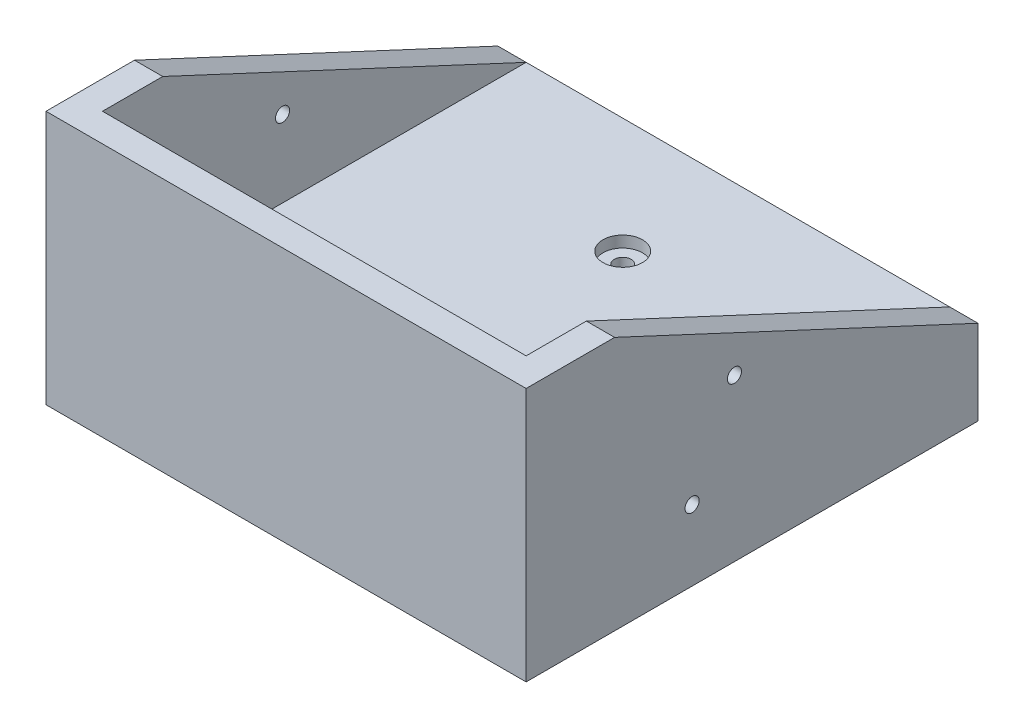
ISO-10303-21;
HEADER;
FILE_DESCRIPTION(('STEP AP214'),'2;1');
FILE_NAME('part.step','',(''),(''),'','','');
FILE_SCHEMA(('AUTOMOTIVE_DESIGN { 1 0 10303 214 1 1 1 1 }'));
ENDSEC;
DATA;
#1=APPLICATION_CONTEXT('core data for automotive mechanical design processes');
#2=APPLICATION_PROTOCOL_DEFINITION('international standard','automotive_design',2000,#1);
#3=PRODUCT_CONTEXT('',#1,'mechanical');
#4=PRODUCT('Part','Part','',(#3));
#5=PRODUCT_RELATED_PRODUCT_CATEGORY('part','',(#4));
#6=PRODUCT_DEFINITION_FORMATION('','',#4);
#7=PRODUCT_DEFINITION_CONTEXT('part definition',#1,'design');
#8=PRODUCT_DEFINITION('design','',#6,#7);
#9=PRODUCT_DEFINITION_SHAPE('','',#8);
#10=(LENGTH_UNIT() NAMED_UNIT(*) SI_UNIT(.MILLI.,.METRE.));
#11=(NAMED_UNIT(*) PLANE_ANGLE_UNIT() SI_UNIT($,.RADIAN.));
#12=(NAMED_UNIT(*) SI_UNIT($,.STERADIAN.) SOLID_ANGLE_UNIT());
#13=UNCERTAINTY_MEASURE_WITH_UNIT(LENGTH_MEASURE(1.E-05),#10,'distance_accuracy_value','');
#14=(GEOMETRIC_REPRESENTATION_CONTEXT(3) GLOBAL_UNCERTAINTY_ASSIGNED_CONTEXT((#13)) GLOBAL_UNIT_ASSIGNED_CONTEXT((#10,
#11,#12)) REPRESENTATION_CONTEXT('',''));
#15=CARTESIAN_POINT('',(0.,0.,0.));
#16=DIRECTION('',(0.,0.,1.));
#17=DIRECTION('',(1.,0.,0.));
#18=AXIS2_PLACEMENT_3D('',#15,#16,#17);
#19=CARTESIAN_POINT('',(0.,0.,0.));
#20=DIRECTION('',(0.,-1.,0.));
#21=DIRECTION('',(0.,0.,-1.));
#22=AXIS2_PLACEMENT_3D('',#19,#20,#21);
#23=PLANE('',#22);
#24=CARTESIAN_POINT('',(0.,0.,-19.6));
#25=DIRECTION('',(0.,-1.,0.));
#26=DIRECTION('',(0.,0.,1.));
#27=AXIS2_PLACEMENT_3D('',#24,#25,#26);
#28=CIRCLE('',#27,1.5);
#29=CARTESIAN_POINT('',(0.,0.,-18.1));
#30=VERTEX_POINT('',#29);
#31=EDGE_CURVE('E308',#30,#30,#28,.T.);
#32=ORIENTED_EDGE('',*,*,#31,.F.);
#33=EDGE_LOOP('',(#32));
#34=FACE_BOUND('',#33,.T.);
#35=CARTESIAN_POINT('',(0.,0.,19.6));
#36=DIRECTION('',(0.,-1.,0.));
#37=DIRECTION('',(0.,0.,-1.));
#38=AXIS2_PLACEMENT_3D('',#35,#36,#37);
#39=CIRCLE('',#38,1.5);
#40=CARTESIAN_POINT('',(0.,0.,18.1));
#41=VERTEX_POINT('',#40);
#42=EDGE_CURVE('E309',#41,#41,#39,.T.);
#43=ORIENTED_EDGE('',*,*,#42,.F.);
#44=EDGE_LOOP('',(#43));
#45=FACE_BOUND('',#44,.T.);
#46=DIRECTION('',(1.,0.,0.));
#47=VECTOR('',#46,1.);
#48=CARTESIAN_POINT('',(-29.5,0.,-24.));
#49=LINE('',#48,#47);
#50=CARTESIAN_POINT('',(-29.5,0.,-24.));
#51=VERTEX_POINT('',#50);
#52=CARTESIAN_POINT('',(29.5,0.,-24.));
#53=VERTEX_POINT('',#52);
#54=EDGE_CURVE('E162',#51,#53,#49,.T.);
#55=ORIENTED_EDGE('',*,*,#54,.T.);
#56=DIRECTION('',(0.,0.,1.));
#57=VECTOR('',#56,1.);
#58=CARTESIAN_POINT('',(29.5,0.,-24.));
#59=LINE('',#58,#57);
#60=CARTESIAN_POINT('',(29.5,0.,-17.0000000000001));
#61=VERTEX_POINT('',#60);
#62=EDGE_CURVE('E190',#53,#61,#59,.T.);
#63=ORIENTED_EDGE('',*,*,#62,.T.);
#64=DIRECTION('',(1.,0.,0.));
#65=VECTOR('',#64,1.);
#66=CARTESIAN_POINT('',(29.5,0.,-17.0000000000001));
#67=LINE('',#66,#65);
#68=CARTESIAN_POINT('',(32.,0.,-17.));
#69=VERTEX_POINT('',#68);
#70=EDGE_CURVE('E168',#61,#69,#67,.T.);
#71=ORIENTED_EDGE('',*,*,#70,.T.);
#72=DIRECTION('',(0.,0.,1.));
#73=VECTOR('',#72,1.);
#74=CARTESIAN_POINT('',(32.,0.,-17.));
#75=LINE('',#74,#73);
#76=CARTESIAN_POINT('',(32.,0.,-5.));
#77=VERTEX_POINT('',#76);
#78=EDGE_CURVE('E193',#69,#77,#75,.T.);
#79=ORIENTED_EDGE('',*,*,#78,.T.);
#80=DIRECTION('',(-1.,0.,0.));
#81=VECTOR('',#80,1.);
#82=CARTESIAN_POINT('',(29.5,0.,-4.99999999999993));
#83=LINE('',#82,#81);
#84=CARTESIAN_POINT('',(29.5,0.,-4.99999999999993));
#85=VERTEX_POINT('',#84);
#86=EDGE_CURVE('E196',#77,#85,#83,.T.);
#87=ORIENTED_EDGE('',*,*,#86,.T.);
#88=DIRECTION('',(0.,0.,1.));
#89=VECTOR('',#88,1.);
#90=CARTESIAN_POINT('',(29.5,0.,-4.99999999999993));
#91=LINE('',#90,#89);
#92=CARTESIAN_POINT('',(29.5,0.,24.));
#93=VERTEX_POINT('',#92);
#94=EDGE_CURVE('E199',#85,#93,#91,.T.);
#95=ORIENTED_EDGE('',*,*,#94,.T.);
#96=DIRECTION('',(-1.,0.,0.));
#97=VECTOR('',#96,1.);
#98=CARTESIAN_POINT('',(29.5,0.,24.));
#99=LINE('',#98,#97);
#100=CARTESIAN_POINT('',(-29.5,0.,24.));
#101=VERTEX_POINT('',#100);
#102=EDGE_CURVE('E202',#93,#101,#99,.T.);
#103=ORIENTED_EDGE('',*,*,#102,.T.);
#104=DIRECTION('',(0.,0.,-1.));
#105=VECTOR('',#104,1.);
#106=CARTESIAN_POINT('',(-29.5,0.,24.));
#107=LINE('',#106,#105);
#108=EDGE_CURVE('E205',#101,#51,#107,.T.);
#109=ORIENTED_EDGE('',*,*,#108,.T.);
#110=EDGE_LOOP('',(#55,#63,#71,#79,#87,#95,#103,#109));
#111=FACE_BOUND('',#110,.T.);
#112=ADVANCED_FACE('F33',(#34,#45,#111),#23,.T.);
#113=CARTESIAN_POINT('',(0.,5.,-19.6));
#114=DIRECTION('',(0.,-1.,0.));
#115=DIRECTION('',(0.,0.,-1.));
#116=AXIS2_PLACEMENT_3D('',#113,#114,#115);
#117=CYLINDRICAL_SURFACE('',#116,1.5);
#118=ORIENTED_EDGE('',*,*,#31,.T.);
#119=EDGE_LOOP('',(#118));
#120=FACE_BOUND('',#119,.T.);
#121=CARTESIAN_POINT('',(0.,3.,-19.6));
#122=DIRECTION('',(0.,1.,0.));
#123=DIRECTION('',(0.,0.,1.));
#124=AXIS2_PLACEMENT_3D('',#121,#122,#123);
#125=CIRCLE('',#124,1.5);
#126=CARTESIAN_POINT('',(0.,3.,-18.1));
#127=VERTEX_POINT('',#126);
#128=EDGE_CURVE('E298',#127,#127,#125,.F.);
#129=ORIENTED_EDGE('',*,*,#128,.F.);
#130=EDGE_LOOP('',(#129));
#131=FACE_BOUND('',#130,.T.);
#132=ADVANCED_FACE('F331',(#120,#131),#117,.F.);
#133=CARTESIAN_POINT('',(0.,5.,19.6));
#134=DIRECTION('',(0.,-1.,0.));
#135=DIRECTION('',(0.,0.,-1.));
#136=AXIS2_PLACEMENT_3D('',#133,#134,#135);
#137=CYLINDRICAL_SURFACE('',#136,1.5);
#138=ORIENTED_EDGE('',*,*,#42,.T.);
#139=EDGE_LOOP('',(#138));
#140=FACE_BOUND('',#139,.T.);
#141=CARTESIAN_POINT('',(0.,3.,19.6));
#142=DIRECTION('',(0.,1.,0.));
#143=DIRECTION('',(0.,0.,1.));
#144=AXIS2_PLACEMENT_3D('',#141,#142,#143);
#145=CIRCLE('',#144,1.5);
#146=CARTESIAN_POINT('',(0.,3.,21.1));
#147=VERTEX_POINT('',#146);
#148=EDGE_CURVE('E268',#147,#147,#145,.F.);
#149=ORIENTED_EDGE('',*,*,#148,.F.);
#150=EDGE_LOOP('',(#149));
#151=FACE_BOUND('',#150,.T.);
#152=ADVANCED_FACE('F333',(#140,#151),#137,.F.);
#153=CARTESIAN_POINT('',(0.,5.,0.));
#154=DIRECTION('',(0.,-1.,0.));
#155=DIRECTION('',(0.,0.,-1.));
#156=AXIS2_PLACEMENT_3D('',#153,#154,#155);
#157=PLANE('',#156);
#158=CARTESIAN_POINT('',(0.,5.,19.6));
#159=DIRECTION('',(0.,1.,0.));
#160=DIRECTION('',(0.,0.,1.));
#161=AXIS2_PLACEMENT_3D('',#158,#159,#160);
#162=CIRCLE('',#161,3.5);
#163=CARTESIAN_POINT('',(0.,5.,23.1));
#164=VERTEX_POINT('',#163);
#165=EDGE_CURVE('E269',#164,#164,#162,.T.);
#166=ORIENTED_EDGE('',*,*,#165,.F.);
#167=EDGE_LOOP('',(#166));
#168=FACE_BOUND('',#167,.T.);
#169=CARTESIAN_POINT('',(0.,5.,-19.6));
#170=DIRECTION('',(0.,1.,0.));
#171=DIRECTION('',(0.,0.,1.));
#172=AXIS2_PLACEMENT_3D('',#169,#170,#171);
#173=CIRCLE('',#172,3.5);
#174=CARTESIAN_POINT('',(0.,5.,-16.1));
#175=VERTEX_POINT('',#174);
#176=EDGE_CURVE('E264',#175,#175,#173,.T.);
#177=ORIENTED_EDGE('',*,*,#176,.F.);
#178=EDGE_LOOP('',(#177));
#179=FACE_BOUND('',#178,.T.);
#180=DIRECTION('',(0.,0.,-1.));
#181=VECTOR('',#180,1.);
#182=CARTESIAN_POINT('',(-37.4999999999998,5.,35.));
#183=LINE('',#182,#181);
#184=CARTESIAN_POINT('',(-37.4999999999998,5.,35.));
#185=VERTEX_POINT('',#184);
#186=CARTESIAN_POINT('',(-37.4999999999998,5.,-39.9999999999999));
#187=VERTEX_POINT('',#186);
#188=EDGE_CURVE('E281',#185,#187,#183,.T.);
#189=ORIENTED_EDGE('',*,*,#188,.F.);
#190=DIRECTION('',(-1.,0.,0.));
#191=VECTOR('',#190,1.);
#192=CARTESIAN_POINT('',(-37.4999999999998,5.,35.));
#193=LINE('',#192,#191);
#194=CARTESIAN_POINT('',(37.5,5.,35.));
#195=VERTEX_POINT('',#194);
#196=EDGE_CURVE('E297',#195,#185,#193,.T.);
#197=ORIENTED_EDGE('',*,*,#196,.F.);
#198=DIRECTION('',(0.,0.,1.));
#199=VECTOR('',#198,1.);
#200=CARTESIAN_POINT('',(37.5,5.,35.));
#201=LINE('',#200,#199);
#202=CARTESIAN_POINT('',(37.5,5.,-40.0000000000001));
#203=VERTEX_POINT('',#202);
#204=EDGE_CURVE('E294',#203,#195,#201,.T.);
#205=ORIENTED_EDGE('',*,*,#204,.F.);
#206=DIRECTION('',(-1.,0.,0.));
#207=VECTOR('',#206,1.);
#208=CARTESIAN_POINT('',(42.5,5.,-40.0000000000001));
#209=LINE('',#208,#207);
#210=EDGE_CURVE('E312',#203,#187,#209,.T.);
#211=ORIENTED_EDGE('',*,*,#210,.T.);
#212=EDGE_LOOP('',(#189,#197,#205,#211));
#213=FACE_BOUND('',#212,.T.);
#214=ADVANCED_FACE('F340',(#168,#179,#213),#157,.F.);
#215=CARTESIAN_POINT('',(-42.5,5.,-40.));
#216=DIRECTION('',(1.,0.,0.));
#217=DIRECTION('',(0.,0.,-1.));
#218=AXIS2_PLACEMENT_3D('',#215,#216,#217);
#219=PLANE('',#218);
#220=CARTESIAN_POINT('',(-42.4999999999998,2.50415315523584,10.6245813322156));
#221=DIRECTION('',(-1.,0.,0.));
#222=DIRECTION('',(0.,0.,1.));
#223=AXIS2_PLACEMENT_3D('',#220,#221,#222);
#224=CIRCLE('',#223,1.25);
#225=CARTESIAN_POINT('',(-42.4999999999998,2.50415315523584,11.8745813322156));
#226=VERTEX_POINT('',#225);
#227=EDGE_CURVE('E237',#226,#226,#224,.T.);
#228=ORIENTED_EDGE('',*,*,#227,.F.);
#229=EDGE_LOOP('',(#228));
#230=FACE_BOUND('',#229,.T.);
#231=CARTESIAN_POINT('',(-42.4999999999999,18.5911163751364,3.12310718631826));
#232=DIRECTION('',(-1.,0.,0.));
#233=DIRECTION('',(0.,0.,1.));
#234=AXIS2_PLACEMENT_3D('',#231,#232,#233);
#235=CIRCLE('',#234,1.25);
#236=CARTESIAN_POINT('',(-42.4999999999999,18.5911163751364,4.37310718631826));
#237=VERTEX_POINT('',#236);
#238=EDGE_CURVE('E249',#237,#237,#235,.T.);
#239=ORIENTED_EDGE('',*,*,#238,.F.);
#240=EDGE_LOOP('',(#239));
#241=FACE_BOUND('',#240,.T.);
#242=DIRECTION('',(0.,0.,1.));
#243=VECTOR('',#242,1.);
#244=CARTESIAN_POINT('',(-42.4999999999998,35.,40.));
#245=LINE('',#244,#243);
#246=CARTESIAN_POINT('',(-42.4999999999998,35.,24.3352076152879));
#247=VERTEX_POINT('',#246);
#248=CARTESIAN_POINT('',(-42.4999999999998,35.,40.));
#249=VERTEX_POINT('',#248);
#250=EDGE_CURVE('E291',#247,#249,#245,.T.);
#251=ORIENTED_EDGE('',*,*,#250,.F.);
#252=DIRECTION('',(0.,0.422618261740694,0.906307787036653));
#253=VECTOR('',#252,1.);
#254=CARTESIAN_POINT('',(-42.4999999999998,35.,24.3352076152879));
#255=LINE('',#254,#253);
#256=CARTESIAN_POINT('',(-42.5,5.,-39.9999999999998));
#257=VERTEX_POINT('',#256);
#258=EDGE_CURVE('E57',#257,#247,#255,.T.);
#259=ORIENTED_EDGE('',*,*,#258,.F.);
#260=DIRECTION('',(0.,-1.,0.));
#261=VECTOR('',#260,1.);
#262=CARTESIAN_POINT('',(-42.5,5.,-40.));
#263=LINE('',#262,#261);
#264=CARTESIAN_POINT('',(-42.5,-10.,-40.));
#265=VERTEX_POINT('',#264);
#266=EDGE_CURVE('E317',#257,#265,#263,.T.);
#267=ORIENTED_EDGE('',*,*,#266,.T.);
#268=DIRECTION('',(0.,0.,-1.));
#269=VECTOR('',#268,1.);
#270=CARTESIAN_POINT('',(-42.4999999999998,-10.,40.));
#271=LINE('',#270,#269);
#272=CARTESIAN_POINT('',(-42.4999999999998,-10.,40.));
#273=VERTEX_POINT('',#272);
#274=EDGE_CURVE('E224',#273,#265,#271,.T.);
#275=ORIENTED_EDGE('',*,*,#274,.F.);
#276=DIRECTION('',(0.,-1.,0.));
#277=VECTOR('',#276,1.);
#278=CARTESIAN_POINT('',(-42.4999999999998,5.,40.));
#279=LINE('',#278,#277);
#280=EDGE_CURVE('E42',#249,#273,#279,.T.);
#281=ORIENTED_EDGE('',*,*,#280,.F.);
#282=EDGE_LOOP('',(#251,#259,#267,#275,#281));
#283=FACE_BOUND('',#282,.T.);
#284=ADVANCED_FACE('F35',(#230,#241,#283),#219,.F.);
#285=CARTESIAN_POINT('',(42.5,5.,40.));
#286=DIRECTION('',(0.,0.,-1.));
#287=DIRECTION('',(-1.,0.,0.));
#288=AXIS2_PLACEMENT_3D('',#285,#286,#287);
#289=PLANE('',#288);
#290=ORIENTED_EDGE('',*,*,#280,.T.);
#291=DIRECTION('',(-1.,0.,0.));
#292=VECTOR('',#291,1.);
#293=CARTESIAN_POINT('',(42.5,-10.,40.));
#294=LINE('',#293,#292);
#295=CARTESIAN_POINT('',(42.5,-10.,40.));
#296=VERTEX_POINT('',#295);
#297=EDGE_CURVE('E169',#296,#273,#294,.T.);
#298=ORIENTED_EDGE('',*,*,#297,.F.);
#299=DIRECTION('',(0.,-1.,0.));
#300=VECTOR('',#299,1.);
#301=CARTESIAN_POINT('',(42.5,5.,40.));
#302=LINE('',#301,#300);
#303=CARTESIAN_POINT('',(42.5,35.,40.));
#304=VERTEX_POINT('',#303);
#305=EDGE_CURVE('E321',#304,#296,#302,.T.);
#306=ORIENTED_EDGE('',*,*,#305,.F.);
#307=DIRECTION('',(1.,0.,0.));
#308=VECTOR('',#307,1.);
#309=CARTESIAN_POINT('',(42.5,35.,40.));
#310=LINE('',#309,#308);
#311=EDGE_CURVE('E277',#249,#304,#310,.T.);
#312=ORIENTED_EDGE('',*,*,#311,.F.);
#313=EDGE_LOOP('',(#290,#298,#306,#312));
#314=FACE_BOUND('',#313,.T.);
#315=ADVANCED_FACE('F357',(#314),#289,.F.);
#316=CARTESIAN_POINT('',(42.5,5.,-40.0000000000001));
#317=DIRECTION('',(-1.,0.,0.));
#318=DIRECTION('',(0.,0.,1.));
#319=AXIS2_PLACEMENT_3D('',#316,#317,#318);
#320=PLANE('',#319);
#321=CARTESIAN_POINT('',(42.5000000000001,2.50415315523584,10.6245813322153));
#322=DIRECTION('',(-1.,0.,0.));
#323=DIRECTION('',(0.,0.,1.));
#324=AXIS2_PLACEMENT_3D('',#321,#322,#323);
#325=CIRCLE('',#324,1.25);
#326=CARTESIAN_POINT('',(42.5000000000001,2.50415315523584,11.8745813322153));
#327=VERTEX_POINT('',#326);
#328=EDGE_CURVE('E233',#327,#327,#325,.T.);
#329=ORIENTED_EDGE('',*,*,#328,.T.);
#330=EDGE_LOOP('',(#329));
#331=FACE_BOUND('',#330,.T.);
#332=CARTESIAN_POINT('',(42.5000000000001,18.5911163751364,3.12310718631803));
#333=DIRECTION('',(-1.,0.,0.));
#334=DIRECTION('',(0.,0.,1.));
#335=AXIS2_PLACEMENT_3D('',#332,#333,#334);
#336=CIRCLE('',#335,1.25);
#337=CARTESIAN_POINT('',(42.5000000000001,18.5911163751364,4.37310718631803));
#338=VERTEX_POINT('',#337);
#339=EDGE_CURVE('E240',#338,#338,#336,.T.);
#340=ORIENTED_EDGE('',*,*,#339,.T.);
#341=EDGE_LOOP('',(#340));
#342=FACE_BOUND('',#341,.T.);
#343=DIRECTION('',(0.,-1.,0.));
#344=VECTOR('',#343,1.);
#345=CARTESIAN_POINT('',(42.5,5.,-40.0000000000001));
#346=LINE('',#345,#344);
#347=CARTESIAN_POINT('',(42.5,5.,-40.0000000000001));
#348=VERTEX_POINT('',#347);
#349=CARTESIAN_POINT('',(42.5,-10.,-40.0000000000001));
#350=VERTEX_POINT('',#349);
#351=EDGE_CURVE('E319',#348,#350,#346,.T.);
#352=ORIENTED_EDGE('',*,*,#351,.F.);
#353=DIRECTION('',(0.,0.422618261740694,0.906307787036653));
#354=VECTOR('',#353,1.);
#355=CARTESIAN_POINT('',(42.5000000000002,35.,24.3352076152877));
#356=LINE('',#355,#354);
#357=CARTESIAN_POINT('',(42.5000000000002,35.,24.3352076152877));
#358=VERTEX_POINT('',#357);
#359=EDGE_CURVE('E241',#348,#358,#356,.T.);
#360=ORIENTED_EDGE('',*,*,#359,.T.);
#361=DIRECTION('',(0.,0.,-1.));
#362=VECTOR('',#361,1.);
#363=CARTESIAN_POINT('',(42.5,35.,40.));
#364=LINE('',#363,#362);
#365=EDGE_CURVE('E280',#304,#358,#364,.T.);
#366=ORIENTED_EDGE('',*,*,#365,.F.);
#367=ORIENTED_EDGE('',*,*,#305,.T.);
#368=DIRECTION('',(0.,0.,1.));
#369=VECTOR('',#368,1.);
#370=CARTESIAN_POINT('',(42.5,-10.,-40.0000000000001));
#371=LINE('',#370,#369);
#372=EDGE_CURVE('E230',#350,#296,#371,.T.);
#373=ORIENTED_EDGE('',*,*,#372,.F.);
#374=EDGE_LOOP('',(#352,#360,#366,#367,#373));
#375=FACE_BOUND('',#374,.T.);
#376=ADVANCED_FACE('F354',(#331,#342,#375),#320,.F.);
#377=CARTESIAN_POINT('',(42.5,5.,-40.0000000000001));
#378=DIRECTION('',(0.,0.,1.));
#379=DIRECTION('',(1.,0.,0.));
#380=AXIS2_PLACEMENT_3D('',#377,#378,#379);
#381=PLANE('',#380);
#382=ORIENTED_EDGE('',*,*,#266,.F.);
#383=DIRECTION('',(-1.,0.,0.));
#384=VECTOR('',#383,1.);
#385=CARTESIAN_POINT('',(42.5,5.,-40.0000000000001));
#386=LINE('',#385,#384);
#387=EDGE_CURVE('E244',#187,#257,#386,.T.);
#388=ORIENTED_EDGE('',*,*,#387,.F.);
#389=ORIENTED_EDGE('',*,*,#210,.F.);
#390=EDGE_CURVE('E250',#348,#203,#386,.T.);
#391=ORIENTED_EDGE('',*,*,#390,.F.);
#392=ORIENTED_EDGE('',*,*,#351,.T.);
#393=DIRECTION('',(1.,0.,0.));
#394=VECTOR('',#393,1.);
#395=CARTESIAN_POINT('',(-42.5,-10.,-40.));
#396=LINE('',#395,#394);
#397=EDGE_CURVE('E227',#265,#350,#396,.T.);
#398=ORIENTED_EDGE('',*,*,#397,.F.);
#399=EDGE_LOOP('',(#382,#388,#389,#391,#392,#398));
#400=FACE_BOUND('',#399,.T.);
#401=ADVANCED_FACE('F350',(#400),#381,.F.);
#402=CARTESIAN_POINT('',(37.5,35.,35.));
#403=DIRECTION('',(1.,0.,0.));
#404=DIRECTION('',(0.,0.,-1.));
#405=AXIS2_PLACEMENT_3D('',#402,#403,#404);
#406=PLANE('',#405);
#407=CARTESIAN_POINT('',(37.5,18.5911163751364,3.12310718631804));
#408=DIRECTION('',(1.,0.,0.));
#409=DIRECTION('',(0.,0.,-1.));
#410=AXIS2_PLACEMENT_3D('',#407,#408,#409);
#411=CIRCLE('',#410,1.25);
#412=CARTESIAN_POINT('',(37.5,18.5911163751364,1.87310718631804));
#413=VERTEX_POINT('',#412);
#414=EDGE_CURVE('E261',#413,#413,#411,.T.);
#415=ORIENTED_EDGE('',*,*,#414,.T.);
#416=EDGE_LOOP('',(#415));
#417=FACE_BOUND('',#416,.T.);
#418=DIRECTION('',(0.,0.,1.));
#419=VECTOR('',#418,1.);
#420=CARTESIAN_POINT('',(37.5,35.,35.));
#421=LINE('',#420,#419);
#422=CARTESIAN_POINT('',(37.5,35.,24.3352076152878));
#423=VERTEX_POINT('',#422);
#424=CARTESIAN_POINT('',(37.5,35.,35.));
#425=VERTEX_POINT('',#424);
#426=EDGE_CURVE('E284',#423,#425,#421,.T.);
#427=ORIENTED_EDGE('',*,*,#426,.F.);
#428=DIRECTION('',(0.,-0.422618261740694,-0.906307787036652));
#429=VECTOR('',#428,1.);
#430=CARTESIAN_POINT('',(37.5,39.0848524716632,33.0952020100301));
#431=LINE('',#430,#429);
#432=EDGE_CURVE('E258',#423,#203,#431,.T.);
#433=ORIENTED_EDGE('',*,*,#432,.T.);
#434=ORIENTED_EDGE('',*,*,#204,.T.);
#435=DIRECTION('',(0.,-1.,0.));
#436=VECTOR('',#435,1.);
#437=CARTESIAN_POINT('',(37.5,35.,35.));
#438=LINE('',#437,#436);
#439=EDGE_CURVE('E305',#425,#195,#438,.T.);
#440=ORIENTED_EDGE('',*,*,#439,.F.);
#441=EDGE_LOOP('',(#427,#433,#434,#440));
#442=FACE_BOUND('',#441,.T.);
#443=ADVANCED_FACE('F353',(#417,#442),#406,.F.);
#444=CARTESIAN_POINT('',(-37.4999999999998,35.,35.));
#445=DIRECTION('',(0.,0.,1.));
#446=DIRECTION('',(1.,0.,0.));
#447=AXIS2_PLACEMENT_3D('',#444,#445,#446);
#448=PLANE('',#447);
#449=ORIENTED_EDGE('',*,*,#196,.T.);
#450=DIRECTION('',(0.,-1.,0.));
#451=VECTOR('',#450,1.);
#452=CARTESIAN_POINT('',(-37.4999999999998,35.,35.));
#453=LINE('',#452,#451);
#454=CARTESIAN_POINT('',(-37.4999999999998,35.,35.));
#455=VERTEX_POINT('',#454);
#456=EDGE_CURVE('E293',#455,#185,#453,.T.);
#457=ORIENTED_EDGE('',*,*,#456,.F.);
#458=DIRECTION('',(-1.,0.,0.));
#459=VECTOR('',#458,1.);
#460=CARTESIAN_POINT('',(-37.4999999999998,35.,35.));
#461=LINE('',#460,#459);
#462=EDGE_CURVE('E286',#425,#455,#461,.T.);
#463=ORIENTED_EDGE('',*,*,#462,.F.);
#464=ORIENTED_EDGE('',*,*,#439,.T.);
#465=EDGE_LOOP('',(#449,#457,#463,#464));
#466=FACE_BOUND('',#465,.T.);
#467=ADVANCED_FACE('F392',(#466),#448,.F.);
#468=CARTESIAN_POINT('',(-37.4999999999998,35.,35.));
#469=DIRECTION('',(-1.,0.,0.));
#470=DIRECTION('',(0.,0.,1.));
#471=AXIS2_PLACEMENT_3D('',#468,#469,#470);
#472=PLANE('',#471);
#473=CARTESIAN_POINT('',(-37.4999999999998,18.5911163751364,3.12310718631825));
#474=DIRECTION('',(-1.,0.,0.));
#475=DIRECTION('',(0.,0.,1.));
#476=AXIS2_PLACEMENT_3D('',#473,#474,#475);
#477=CIRCLE('',#476,1.25);
#478=CARTESIAN_POINT('',(-37.4999999999998,18.5911163751364,4.37310718631825));
#479=VERTEX_POINT('',#478);
#480=EDGE_CURVE('E37',#479,#479,#477,.T.);
#481=ORIENTED_EDGE('',*,*,#480,.T.);
#482=EDGE_LOOP('',(#481));
#483=FACE_BOUND('',#482,.T.);
#484=ORIENTED_EDGE('',*,*,#188,.T.);
#485=DIRECTION('',(0.,0.422618261740694,0.906307787036652));
#486=VECTOR('',#485,1.);
#487=CARTESIAN_POINT('',(-37.4999999999998,39.0848524716631,33.0952020100301));
#488=LINE('',#487,#486);
#489=CARTESIAN_POINT('',(-37.4999999999998,35.,24.3352076152879));
#490=VERTEX_POINT('',#489);
#491=EDGE_CURVE('E236',#187,#490,#488,.T.);
#492=ORIENTED_EDGE('',*,*,#491,.T.);
#493=DIRECTION('',(0.,0.,-1.));
#494=VECTOR('',#493,1.);
#495=CARTESIAN_POINT('',(-37.4999999999998,35.,35.));
#496=LINE('',#495,#494);
#497=EDGE_CURVE('E288',#455,#490,#496,.T.);
#498=ORIENTED_EDGE('',*,*,#497,.F.);
#499=ORIENTED_EDGE('',*,*,#456,.T.);
#500=EDGE_LOOP('',(#484,#492,#498,#499));
#501=FACE_BOUND('',#500,.T.);
#502=ADVANCED_FACE('F396',(#483,#501),#472,.F.);
#503=CARTESIAN_POINT('',(0.,35.,0.));
#504=DIRECTION('',(0.,-1.,0.));
#505=DIRECTION('',(0.,0.,-1.));
#506=AXIS2_PLACEMENT_3D('',#503,#504,#505);
#507=PLANE('',#506);
#508=ORIENTED_EDGE('',*,*,#365,.T.);
#509=DIRECTION('',(-1.,0.,0.));
#510=VECTOR('',#509,1.);
#511=CARTESIAN_POINT('',(42.5000000000002,35.,24.3352076152877));
#512=LINE('',#511,#510);
#513=EDGE_CURVE('E246',#358,#423,#512,.T.);
#514=ORIENTED_EDGE('',*,*,#513,.T.);
#515=ORIENTED_EDGE('',*,*,#426,.T.);
#516=ORIENTED_EDGE('',*,*,#462,.T.);
#517=ORIENTED_EDGE('',*,*,#497,.T.);
#518=DIRECTION('',(-1.,0.,0.));
#519=VECTOR('',#518,1.);
#520=CARTESIAN_POINT('',(0.,35.,24.3352076152878));
#521=LINE('',#520,#519);
#522=EDGE_CURVE('E11',#490,#247,#521,.T.);
#523=ORIENTED_EDGE('',*,*,#522,.T.);
#524=ORIENTED_EDGE('',*,*,#250,.T.);
#525=ORIENTED_EDGE('',*,*,#311,.T.);
#526=EDGE_LOOP('',(#508,#514,#515,#516,#517,#523,#524,#525));
#527=FACE_BOUND('',#526,.T.);
#528=ADVANCED_FACE('F379',(#527),#507,.F.);
#529=CARTESIAN_POINT('',(0.,3.,19.6));
#530=DIRECTION('',(0.,1.,0.));
#531=DIRECTION('',(0.,0.,1.));
#532=AXIS2_PLACEMENT_3D('',#529,#530,#531);
#533=PLANE('',#532);
#534=CARTESIAN_POINT('',(0.,3.,19.6));
#535=DIRECTION('',(0.,1.,0.));
#536=DIRECTION('',(0.,0.,1.));
#537=AXIS2_PLACEMENT_3D('',#534,#535,#536);
#538=CIRCLE('',#537,3.5);
#539=CARTESIAN_POINT('',(0.,3.,23.1));
#540=VERTEX_POINT('',#539);
#541=EDGE_CURVE('E265',#540,#540,#538,.T.);
#542=ORIENTED_EDGE('',*,*,#541,.T.);
#543=EDGE_LOOP('',(#542));
#544=FACE_BOUND('',#543,.T.);
#545=ORIENTED_EDGE('',*,*,#148,.T.);
#546=EDGE_LOOP('',(#545));
#547=FACE_BOUND('',#546,.T.);
#548=ADVANCED_FACE('F416',(#544,#547),#533,.T.);
#549=CARTESIAN_POINT('',(0.,3.,19.6));
#550=DIRECTION('',(0.,1.,0.));
#551=DIRECTION('',(0.,0.,1.));
#552=AXIS2_PLACEMENT_3D('',#549,#550,#551);
#553=CYLINDRICAL_SURFACE('',#552,3.5);
#554=ORIENTED_EDGE('',*,*,#541,.F.);
#555=EDGE_LOOP('',(#554));
#556=FACE_BOUND('',#555,.T.);
#557=ORIENTED_EDGE('',*,*,#165,.T.);
#558=EDGE_LOOP('',(#557));
#559=FACE_BOUND('',#558,.T.);
#560=ADVANCED_FACE('F419',(#556,#559),#553,.F.);
#561=CARTESIAN_POINT('',(0.,3.,-19.6));
#562=DIRECTION('',(0.,1.,0.));
#563=DIRECTION('',(0.,0.,1.));
#564=AXIS2_PLACEMENT_3D('',#561,#562,#563);
#565=PLANE('',#564);
#566=CARTESIAN_POINT('',(0.,3.,-19.6));
#567=DIRECTION('',(0.,1.,0.));
#568=DIRECTION('',(0.,0.,1.));
#569=AXIS2_PLACEMENT_3D('',#566,#567,#568);
#570=CIRCLE('',#569,3.5);
#571=CARTESIAN_POINT('',(0.,3.,-16.1));
#572=VERTEX_POINT('',#571);
#573=EDGE_CURVE('E272',#572,#572,#570,.T.);
#574=ORIENTED_EDGE('',*,*,#573,.T.);
#575=EDGE_LOOP('',(#574));
#576=FACE_BOUND('',#575,.T.);
#577=ORIENTED_EDGE('',*,*,#128,.T.);
#578=EDGE_LOOP('',(#577));
#579=FACE_BOUND('',#578,.T.);
#580=ADVANCED_FACE('F329',(#576,#579),#565,.T.);
#581=CARTESIAN_POINT('',(0.,3.,-19.6));
#582=DIRECTION('',(0.,1.,0.));
#583=DIRECTION('',(0.,0.,1.));
#584=AXIS2_PLACEMENT_3D('',#581,#582,#583);
#585=CYLINDRICAL_SURFACE('',#584,3.5);
#586=ORIENTED_EDGE('',*,*,#573,.F.);
#587=EDGE_LOOP('',(#586));
#588=FACE_BOUND('',#587,.T.);
#589=ORIENTED_EDGE('',*,*,#176,.T.);
#590=EDGE_LOOP('',(#589));
#591=FACE_BOUND('',#590,.T.);
#592=ADVANCED_FACE('F399',(#588,#591),#585,.F.);
#593=CARTESIAN_POINT('',(42.5000000000002,35.,24.3352076152877));
#594=DIRECTION('',(0.,-0.906307787036652,0.422618261740694));
#595=DIRECTION('',(0.,-0.422618261740694,-0.906307787036652));
#596=AXIS2_PLACEMENT_3D('',#593,#594,#595);
#597=PLANE('',#596);
#598=ORIENTED_EDGE('',*,*,#387,.T.);
#599=ORIENTED_EDGE('',*,*,#258,.T.);
#600=ORIENTED_EDGE('',*,*,#522,.F.);
#601=ORIENTED_EDGE('',*,*,#491,.F.);
#602=EDGE_LOOP('',(#598,#599,#600,#601));
#603=FACE_BOUND('',#602,.T.);
#604=ADVANCED_FACE('F397',(#603),#597,.F.);
#605=ORIENTED_EDGE('',*,*,#513,.F.);
#606=ORIENTED_EDGE('',*,*,#359,.F.);
#607=ORIENTED_EDGE('',*,*,#390,.T.);
#608=ORIENTED_EDGE('',*,*,#432,.F.);
#609=EDGE_LOOP('',(#605,#606,#607,#608));
#610=FACE_BOUND('',#609,.T.);
#611=ADVANCED_FACE('F384',(#610),#597,.F.);
#612=CARTESIAN_POINT('',(42.5000000000001,18.5911163751364,3.12310718631803));
#613=DIRECTION('',(-1.,0.,0.));
#614=DIRECTION('',(0.,0.,1.));
#615=AXIS2_PLACEMENT_3D('',#612,#613,#614);
#616=CYLINDRICAL_SURFACE('',#615,1.25);
#617=ORIENTED_EDGE('',*,*,#238,.T.);
#618=EDGE_LOOP('',(#617));
#619=FACE_BOUND('',#618,.T.);
#620=ORIENTED_EDGE('',*,*,#480,.F.);
#621=EDGE_LOOP('',(#620));
#622=FACE_BOUND('',#621,.T.);
#623=ADVANCED_FACE('F405',(#619,#622),#616,.F.);
#624=ORIENTED_EDGE('',*,*,#339,.F.);
#625=EDGE_LOOP('',(#624));
#626=FACE_BOUND('',#625,.T.);
#627=ORIENTED_EDGE('',*,*,#414,.F.);
#628=EDGE_LOOP('',(#627));
#629=FACE_BOUND('',#628,.T.);
#630=ADVANCED_FACE('F412',(#626,#629),#616,.F.);
#631=CARTESIAN_POINT('',(42.5000000000001,2.50415315523584,10.6245813322153));
#632=DIRECTION('',(-1.,0.,0.));
#633=DIRECTION('',(0.,0.,1.));
#634=AXIS2_PLACEMENT_3D('',#631,#632,#633);
#635=CYLINDRICAL_SURFACE('',#634,1.25);
#636=ORIENTED_EDGE('',*,*,#328,.F.);
#637=EDGE_LOOP('',(#636));
#638=FACE_BOUND('',#637,.T.);
#639=ORIENTED_EDGE('',*,*,#227,.T.);
#640=EDGE_LOOP('',(#639));
#641=FACE_BOUND('',#640,.T.);
#642=ADVANCED_FACE('F410',(#638,#641),#635,.F.);
#643=CARTESIAN_POINT('',(0.,-10.,0.));
#644=DIRECTION('',(0.,-1.,0.));
#645=DIRECTION('',(0.,0.,-1.));
#646=AXIS2_PLACEMENT_3D('',#643,#644,#645);
#647=PLANE('',#646);
#648=ORIENTED_EDGE('',*,*,#297,.T.);
#649=ORIENTED_EDGE('',*,*,#274,.T.);
#650=ORIENTED_EDGE('',*,*,#397,.T.);
#651=ORIENTED_EDGE('',*,*,#372,.T.);
#652=EDGE_LOOP('',(#648,#649,#650,#651));
#653=FACE_BOUND('',#652,.T.);
#654=DIRECTION('',(1.,0.,0.));
#655=VECTOR('',#654,1.);
#656=CARTESIAN_POINT('',(29.5,-10.,-17.0000000000001));
#657=LINE('',#656,#655);
#658=CARTESIAN_POINT('',(29.5,-10.,-17.0000000000001));
#659=VERTEX_POINT('',#658);
#660=CARTESIAN_POINT('',(32.,-10.,-17.));
#661=VERTEX_POINT('',#660);
#662=EDGE_CURVE('E161',#659,#661,#657,.T.);
#663=ORIENTED_EDGE('',*,*,#662,.F.);
#664=DIRECTION('',(0.,0.,1.));
#665=VECTOR('',#664,1.);
#666=CARTESIAN_POINT('',(29.5,-10.,-24.));
#667=LINE('',#666,#665);
#668=CARTESIAN_POINT('',(29.5,-10.,-24.));
#669=VERTEX_POINT('',#668);
#670=EDGE_CURVE('E153',#669,#659,#667,.T.);
#671=ORIENTED_EDGE('',*,*,#670,.F.);
#672=DIRECTION('',(1.,0.,0.));
#673=VECTOR('',#672,1.);
#674=CARTESIAN_POINT('',(-29.5,-10.,-24.));
#675=LINE('',#674,#673);
#676=CARTESIAN_POINT('',(-29.5,-10.,-24.));
#677=VERTEX_POINT('',#676);
#678=EDGE_CURVE('E188',#677,#669,#675,.T.);
#679=ORIENTED_EDGE('',*,*,#678,.F.);
#680=DIRECTION('',(0.,0.,-1.));
#681=VECTOR('',#680,1.);
#682=CARTESIAN_POINT('',(-29.5,-10.,24.));
#683=LINE('',#682,#681);
#684=CARTESIAN_POINT('',(-29.5,-10.,24.));
#685=VERTEX_POINT('',#684);
#686=EDGE_CURVE('E185',#685,#677,#683,.T.);
#687=ORIENTED_EDGE('',*,*,#686,.F.);
#688=DIRECTION('',(-1.,0.,0.));
#689=VECTOR('',#688,1.);
#690=CARTESIAN_POINT('',(29.5,-10.,24.));
#691=LINE('',#690,#689);
#692=CARTESIAN_POINT('',(29.5,-10.,24.));
#693=VERTEX_POINT('',#692);
#694=EDGE_CURVE('E183',#693,#685,#691,.T.);
#695=ORIENTED_EDGE('',*,*,#694,.F.);
#696=DIRECTION('',(0.,0.,1.));
#697=VECTOR('',#696,1.);
#698=CARTESIAN_POINT('',(29.5,-10.,-4.99999999999993));
#699=LINE('',#698,#697);
#700=CARTESIAN_POINT('',(29.5,-10.,-4.99999999999993));
#701=VERTEX_POINT('',#700);
#702=EDGE_CURVE('E181',#701,#693,#699,.T.);
#703=ORIENTED_EDGE('',*,*,#702,.F.);
#704=DIRECTION('',(-1.,0.,0.));
#705=VECTOR('',#704,1.);
#706=CARTESIAN_POINT('',(29.5,-10.,-4.99999999999993));
#707=LINE('',#706,#705);
#708=CARTESIAN_POINT('',(32.,-10.,-5.));
#709=VERTEX_POINT('',#708);
#710=EDGE_CURVE('E177',#709,#701,#707,.T.);
#711=ORIENTED_EDGE('',*,*,#710,.F.);
#712=DIRECTION('',(0.,0.,1.));
#713=VECTOR('',#712,1.);
#714=CARTESIAN_POINT('',(32.,-10.,-17.));
#715=LINE('',#714,#713);
#716=EDGE_CURVE('E175',#661,#709,#715,.T.);
#717=ORIENTED_EDGE('',*,*,#716,.F.);
#718=EDGE_LOOP('',(#663,#671,#679,#687,#695,#703,#711,#717));
#719=FACE_BOUND('',#718,.T.);
#720=ADVANCED_FACE('F173',(#653,#719),#647,.T.);
#721=CARTESIAN_POINT('',(29.5,-10.,-24.));
#722=DIRECTION('',(-1.,0.,0.));
#723=DIRECTION('',(0.,0.,1.));
#724=AXIS2_PLACEMENT_3D('',#721,#722,#723);
#725=PLANE('',#724);
#726=ORIENTED_EDGE('',*,*,#62,.F.);
#727=DIRECTION('',(0.,1.,0.));
#728=VECTOR('',#727,1.);
#729=CARTESIAN_POINT('',(29.5,-10.,-24.));
#730=LINE('',#729,#728);
#731=EDGE_CURVE('E49',#669,#53,#730,.T.);
#732=ORIENTED_EDGE('',*,*,#731,.F.);
#733=ORIENTED_EDGE('',*,*,#670,.T.);
#734=DIRECTION('',(0.,1.,0.));
#735=VECTOR('',#734,1.);
#736=CARTESIAN_POINT('',(29.5,-10.,-17.0000000000001));
#737=LINE('',#736,#735);
#738=EDGE_CURVE('E156',#659,#61,#737,.T.);
#739=ORIENTED_EDGE('',*,*,#738,.T.);
#740=EDGE_LOOP('',(#726,#732,#733,#739));
#741=FACE_BOUND('',#740,.T.);
#742=ADVANCED_FACE('F155',(#741),#725,.T.);
#743=CARTESIAN_POINT('',(29.5,-10.,-17.0000000000001));
#744=DIRECTION('',(0.,0.,1.));
#745=DIRECTION('',(1.,0.,0.));
#746=AXIS2_PLACEMENT_3D('',#743,#744,#745);
#747=PLANE('',#746);
#748=ORIENTED_EDGE('',*,*,#70,.F.);
#749=ORIENTED_EDGE('',*,*,#738,.F.);
#750=ORIENTED_EDGE('',*,*,#662,.T.);
#751=DIRECTION('',(0.,1.,0.));
#752=VECTOR('',#751,1.);
#753=CARTESIAN_POINT('',(32.,-10.,-17.));
#754=LINE('',#753,#752);
#755=EDGE_CURVE('E170',#661,#69,#754,.T.);
#756=ORIENTED_EDGE('',*,*,#755,.T.);
#757=EDGE_LOOP('',(#748,#749,#750,#756));
#758=FACE_BOUND('',#757,.T.);
#759=ADVANCED_FACE('F165',(#758),#747,.T.);
#760=CARTESIAN_POINT('',(32.,-10.,-17.));
#761=DIRECTION('',(-1.,0.,0.));
#762=DIRECTION('',(0.,0.,1.));
#763=AXIS2_PLACEMENT_3D('',#760,#761,#762);
#764=PLANE('',#763);
#765=ORIENTED_EDGE('',*,*,#78,.F.);
#766=ORIENTED_EDGE('',*,*,#755,.F.);
#767=ORIENTED_EDGE('',*,*,#716,.T.);
#768=DIRECTION('',(0.,1.,0.));
#769=VECTOR('',#768,1.);
#770=CARTESIAN_POINT('',(32.,-10.,-5.));
#771=LINE('',#770,#769);
#772=EDGE_CURVE('E219',#709,#77,#771,.T.);
#773=ORIENTED_EDGE('',*,*,#772,.T.);
#774=EDGE_LOOP('',(#765,#766,#767,#773));
#775=FACE_BOUND('',#774,.T.);
#776=ADVANCED_FACE('F532',(#775),#764,.T.);
#777=CARTESIAN_POINT('',(29.5,-10.,-4.99999999999993));
#778=DIRECTION('',(0.,0.,-1.));
#779=DIRECTION('',(-1.,0.,0.));
#780=AXIS2_PLACEMENT_3D('',#777,#778,#779);
#781=PLANE('',#780);
#782=ORIENTED_EDGE('',*,*,#86,.F.);
#783=ORIENTED_EDGE('',*,*,#772,.F.);
#784=ORIENTED_EDGE('',*,*,#710,.T.);
#785=DIRECTION('',(0.,1.,0.));
#786=VECTOR('',#785,1.);
#787=CARTESIAN_POINT('',(29.5,-10.,-4.99999999999993));
#788=LINE('',#787,#786);
#789=EDGE_CURVE('E217',#701,#85,#788,.T.);
#790=ORIENTED_EDGE('',*,*,#789,.T.);
#791=EDGE_LOOP('',(#782,#783,#784,#790));
#792=FACE_BOUND('',#791,.T.);
#793=ADVANCED_FACE('F541',(#792),#781,.T.);
#794=CARTESIAN_POINT('',(29.5,-10.,-4.99999999999993));
#795=DIRECTION('',(-1.,0.,0.));
#796=DIRECTION('',(0.,0.,1.));
#797=AXIS2_PLACEMENT_3D('',#794,#795,#796);
#798=PLANE('',#797);
#799=ORIENTED_EDGE('',*,*,#94,.F.);
#800=ORIENTED_EDGE('',*,*,#789,.F.);
#801=ORIENTED_EDGE('',*,*,#702,.T.);
#802=DIRECTION('',(0.,1.,0.));
#803=VECTOR('',#802,1.);
#804=CARTESIAN_POINT('',(29.5,-10.,24.));
#805=LINE('',#804,#803);
#806=EDGE_CURVE('E215',#693,#93,#805,.T.);
#807=ORIENTED_EDGE('',*,*,#806,.T.);
#808=EDGE_LOOP('',(#799,#800,#801,#807));
#809=FACE_BOUND('',#808,.T.);
#810=ADVANCED_FACE('F551',(#809),#798,.T.);
#811=CARTESIAN_POINT('',(29.5,-10.,24.));
#812=DIRECTION('',(0.,0.,-1.));
#813=DIRECTION('',(-1.,0.,0.));
#814=AXIS2_PLACEMENT_3D('',#811,#812,#813);
#815=PLANE('',#814);
#816=ORIENTED_EDGE('',*,*,#102,.F.);
#817=ORIENTED_EDGE('',*,*,#806,.F.);
#818=ORIENTED_EDGE('',*,*,#694,.T.);
#819=DIRECTION('',(0.,1.,0.));
#820=VECTOR('',#819,1.);
#821=CARTESIAN_POINT('',(-29.5,-10.,24.));
#822=LINE('',#821,#820);
#823=EDGE_CURVE('E213',#685,#101,#822,.T.);
#824=ORIENTED_EDGE('',*,*,#823,.T.);
#825=EDGE_LOOP('',(#816,#817,#818,#824));
#826=FACE_BOUND('',#825,.T.);
#827=ADVANCED_FACE('F561',(#826),#815,.T.);
#828=CARTESIAN_POINT('',(-29.5,-10.,24.));
#829=DIRECTION('',(1.,0.,0.));
#830=DIRECTION('',(0.,0.,-1.));
#831=AXIS2_PLACEMENT_3D('',#828,#829,#830);
#832=PLANE('',#831);
#833=ORIENTED_EDGE('',*,*,#108,.F.);
#834=ORIENTED_EDGE('',*,*,#823,.F.);
#835=ORIENTED_EDGE('',*,*,#686,.T.);
#836=DIRECTION('',(0.,1.,0.));
#837=VECTOR('',#836,1.);
#838=CARTESIAN_POINT('',(-29.5,-10.,-24.));
#839=LINE('',#838,#837);
#840=EDGE_CURVE('E211',#677,#51,#839,.T.);
#841=ORIENTED_EDGE('',*,*,#840,.T.);
#842=EDGE_LOOP('',(#833,#834,#835,#841));
#843=FACE_BOUND('',#842,.T.);
#844=ADVANCED_FACE('F571',(#843),#832,.T.);
#845=CARTESIAN_POINT('',(-29.5,-10.,-24.));
#846=DIRECTION('',(0.,0.,1.));
#847=DIRECTION('',(1.,0.,0.));
#848=AXIS2_PLACEMENT_3D('',#845,#846,#847);
#849=PLANE('',#848);
#850=ORIENTED_EDGE('',*,*,#54,.F.);
#851=ORIENTED_EDGE('',*,*,#840,.F.);
#852=ORIENTED_EDGE('',*,*,#678,.T.);
#853=ORIENTED_EDGE('',*,*,#731,.T.);
#854=EDGE_LOOP('',(#850,#851,#852,#853));
#855=FACE_BOUND('',#854,.T.);
#856=ADVANCED_FACE('F581',(#855),#849,.T.);
#857=CLOSED_SHELL('',(#112,#132,#152,#214,#284,#315,#376,#401,#443,#467,#502,#528,#548,#560,
#580,#592,#604,#611,#623,#630,#642,#720,#742,#759,#776,#793,#810,#827,#844,#856));
#858=MANIFOLD_SOLID_BREP('B2',#857);
#859=ADVANCED_BREP_SHAPE_REPRESENTATION('',(#18,#858),#14);
#860=SHAPE_DEFINITION_REPRESENTATION(#9,#859);
ENDSEC;
END-ISO-10303-21;
